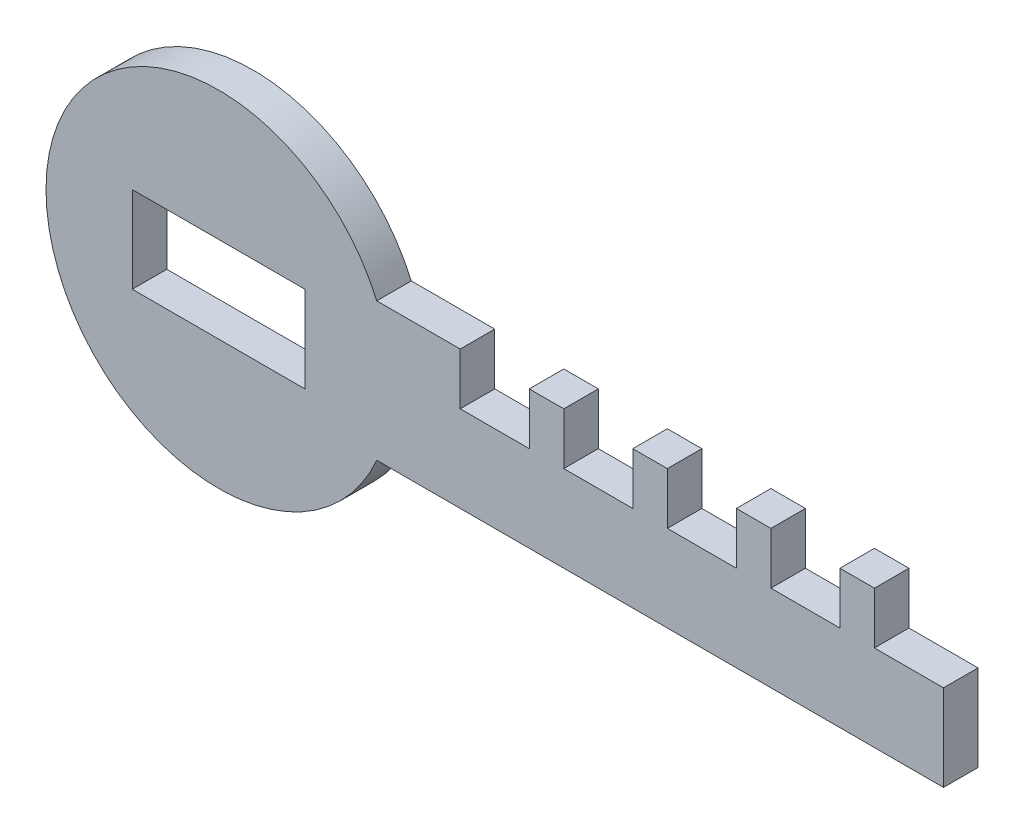
ISO-10303-21;
HEADER;
FILE_DESCRIPTION(('STEP AP214'),'2;1');
FILE_NAME('part.step','',(''),(''),'','','');
FILE_SCHEMA(('AUTOMOTIVE_DESIGN { 1 0 10303 214 1 1 1 1 }'));
ENDSEC;
DATA;
#1=APPLICATION_CONTEXT('core data for automotive mechanical design processes');
#2=APPLICATION_PROTOCOL_DEFINITION('international standard','automotive_design',2000,#1);
#3=PRODUCT_CONTEXT('',#1,'mechanical');
#4=PRODUCT('Part','Part','',(#3));
#5=PRODUCT_RELATED_PRODUCT_CATEGORY('part','',(#4));
#6=PRODUCT_DEFINITION_FORMATION('','',#4);
#7=PRODUCT_DEFINITION_CONTEXT('part definition',#1,'design');
#8=PRODUCT_DEFINITION('design','',#6,#7);
#9=PRODUCT_DEFINITION_SHAPE('','',#8);
#10=(LENGTH_UNIT() NAMED_UNIT(*) SI_UNIT(.MILLI.,.METRE.));
#11=(NAMED_UNIT(*) PLANE_ANGLE_UNIT() SI_UNIT($,.RADIAN.));
#12=(NAMED_UNIT(*) SI_UNIT($,.STERADIAN.) SOLID_ANGLE_UNIT());
#13=UNCERTAINTY_MEASURE_WITH_UNIT(LENGTH_MEASURE(1.E-05),#10,'distance_accuracy_value','');
#14=(GEOMETRIC_REPRESENTATION_CONTEXT(3) GLOBAL_UNCERTAINTY_ASSIGNED_CONTEXT((#13)) GLOBAL_UNIT_ASSIGNED_CONTEXT((#10,
#11,#12)) REPRESENTATION_CONTEXT('',''));
#15=CARTESIAN_POINT('',(0.,0.,0.));
#16=DIRECTION('',(0.,0.,1.));
#17=DIRECTION('',(1.,0.,0.));
#18=AXIS2_PLACEMENT_3D('',#15,#16,#17);
#19=CARTESIAN_POINT('',(42.,4.,1.));
#20=DIRECTION('',(0.,-1.,0.));
#21=DIRECTION('',(0.,0.,-1.));
#22=AXIS2_PLACEMENT_3D('',#19,#20,#21);
#23=PLANE('',#22);
#24=DIRECTION('',(-1.,0.,0.));
#25=VECTOR('',#24,1.);
#26=CARTESIAN_POINT('',(42.,4.,1.));
#27=LINE('',#26,#25);
#28=CARTESIAN_POINT('',(14.,4.,1.));
#29=VERTEX_POINT('',#28);
#30=CARTESIAN_POINT('',(9.16515138991168,4.,1.));
#31=VERTEX_POINT('',#30);
#32=EDGE_CURVE('E428',#29,#31,#27,.T.);
#33=ORIENTED_EDGE('',*,*,#32,.F.);
#34=DIRECTION('',(0.,0.,-1.));
#35=VECTOR('',#34,1.);
#36=CARTESIAN_POINT('',(14.,4.,1.));
#37=LINE('',#36,#35);
#38=CARTESIAN_POINT('',(14.,4.,-1.));
#39=VERTEX_POINT('',#38);
#40=EDGE_CURVE('E11',#29,#39,#37,.T.);
#41=ORIENTED_EDGE('',*,*,#40,.T.);
#42=DIRECTION('',(-1.,0.,0.));
#43=VECTOR('',#42,1.);
#44=CARTESIAN_POINT('',(42.,4.,-1.));
#45=LINE('',#44,#43);
#46=CARTESIAN_POINT('',(9.1651513899117,4.,-1.));
#47=VERTEX_POINT('',#46);
#48=EDGE_CURVE('E251',#39,#47,#45,.T.);
#49=ORIENTED_EDGE('',*,*,#48,.T.);
#50=DIRECTION('',(0.,0.,-1.));
#51=VECTOR('',#50,1.);
#52=CARTESIAN_POINT('',(9.16515138991168,4.,1.));
#53=LINE('',#52,#51);
#54=EDGE_CURVE('E446',#47,#31,#53,.F.);
#55=ORIENTED_EDGE('',*,*,#54,.T.);
#56=EDGE_LOOP('',(#33,#41,#49,#55));
#57=FACE_BOUND('',#56,.T.);
#58=ADVANCED_FACE('F51',(#57),#23,.F.);
#59=CARTESIAN_POINT('',(20.,4.,-1.));
#60=VERTEX_POINT('',#59);
#61=CARTESIAN_POINT('',(18.,4.,-1.));
#62=VERTEX_POINT('',#61);
#63=EDGE_CURVE('E441',#60,#62,#45,.T.);
#64=ORIENTED_EDGE('',*,*,#63,.T.);
#65=DIRECTION('',(0.,0.,1.));
#66=VECTOR('',#65,1.);
#67=CARTESIAN_POINT('',(18.,4.,1.));
#68=LINE('',#67,#66);
#69=CARTESIAN_POINT('',(18.,4.,1.));
#70=VERTEX_POINT('',#69);
#71=EDGE_CURVE('E61',#62,#70,#68,.T.);
#72=ORIENTED_EDGE('',*,*,#71,.T.);
#73=CARTESIAN_POINT('',(20.,4.,1.));
#74=VERTEX_POINT('',#73);
#75=EDGE_CURVE('E431',#74,#70,#27,.T.);
#76=ORIENTED_EDGE('',*,*,#75,.F.);
#77=DIRECTION('',(0.,0.,-1.));
#78=VECTOR('',#77,1.);
#79=CARTESIAN_POINT('',(20.,4.,1.));
#80=LINE('',#79,#78);
#81=EDGE_CURVE('E484',#74,#60,#80,.T.);
#82=ORIENTED_EDGE('',*,*,#81,.T.);
#83=EDGE_LOOP('',(#64,#72,#76,#82));
#84=FACE_BOUND('',#83,.T.);
#85=ADVANCED_FACE('F493',(#84),#23,.F.);
#86=CARTESIAN_POINT('',(26.,4.,-1.));
#87=VERTEX_POINT('',#86);
#88=CARTESIAN_POINT('',(24.,4.,-1.));
#89=VERTEX_POINT('',#88);
#90=EDGE_CURVE('E546',#87,#89,#45,.T.);
#91=ORIENTED_EDGE('',*,*,#90,.T.);
#92=DIRECTION('',(0.,0.,1.));
#93=VECTOR('',#92,1.);
#94=CARTESIAN_POINT('',(24.,4.,1.));
#95=LINE('',#94,#93);
#96=CARTESIAN_POINT('',(24.,4.,1.));
#97=VERTEX_POINT('',#96);
#98=EDGE_CURVE('E481',#89,#97,#95,.T.);
#99=ORIENTED_EDGE('',*,*,#98,.T.);
#100=CARTESIAN_POINT('',(26.,4.,1.));
#101=VERTEX_POINT('',#100);
#102=EDGE_CURVE('E501',#101,#97,#27,.T.);
#103=ORIENTED_EDGE('',*,*,#102,.F.);
#104=DIRECTION('',(0.,0.,-1.));
#105=VECTOR('',#104,1.);
#106=CARTESIAN_POINT('',(26.,4.,1.));
#107=LINE('',#106,#105);
#108=EDGE_CURVE('E477',#101,#87,#107,.T.);
#109=ORIENTED_EDGE('',*,*,#108,.T.);
#110=EDGE_LOOP('',(#91,#99,#103,#109));
#111=FACE_BOUND('',#110,.T.);
#112=ADVANCED_FACE('F545',(#111),#23,.F.);
#113=CARTESIAN_POINT('',(32.,4.,-1.));
#114=VERTEX_POINT('',#113);
#115=CARTESIAN_POINT('',(30.,4.,-1.));
#116=VERTEX_POINT('',#115);
#117=EDGE_CURVE('E533',#114,#116,#45,.T.);
#118=ORIENTED_EDGE('',*,*,#117,.T.);
#119=DIRECTION('',(0.,0.,1.));
#120=VECTOR('',#119,1.);
#121=CARTESIAN_POINT('',(30.,4.,1.));
#122=LINE('',#121,#120);
#123=CARTESIAN_POINT('',(30.,4.,1.));
#124=VERTEX_POINT('',#123);
#125=EDGE_CURVE('E473',#116,#124,#122,.T.);
#126=ORIENTED_EDGE('',*,*,#125,.T.);
#127=CARTESIAN_POINT('',(32.,4.,1.));
#128=VERTEX_POINT('',#127);
#129=EDGE_CURVE('E505',#128,#124,#27,.T.);
#130=ORIENTED_EDGE('',*,*,#129,.F.);
#131=DIRECTION('',(0.,0.,-1.));
#132=VECTOR('',#131,1.);
#133=CARTESIAN_POINT('',(32.,4.,1.));
#134=LINE('',#133,#132);
#135=EDGE_CURVE('E469',#128,#114,#134,.T.);
#136=ORIENTED_EDGE('',*,*,#135,.T.);
#137=EDGE_LOOP('',(#118,#126,#130,#136));
#138=FACE_BOUND('',#137,.T.);
#139=ADVANCED_FACE('F532',(#138),#23,.F.);
#140=CARTESIAN_POINT('',(0.,0.,1.));
#141=DIRECTION('',(0.,0.,-1.));
#142=DIRECTION('',(-1.,0.,0.));
#143=AXIS2_PLACEMENT_3D('',#140,#141,#142);
#144=CYLINDRICAL_SURFACE('',#143,10.);
#145=DIRECTION('',(0.,0.,-1.));
#146=VECTOR('',#145,1.);
#147=CARTESIAN_POINT('',(9.16515138991168,-4.,1.));
#148=LINE('',#147,#146);
#149=CARTESIAN_POINT('',(9.16515138991168,-4.,1.));
#150=VERTEX_POINT('',#149);
#151=CARTESIAN_POINT('',(9.16515138991168,-4.,-1.));
#152=VERTEX_POINT('',#151);
#153=EDGE_CURVE('E450',#150,#152,#148,.T.);
#154=ORIENTED_EDGE('',*,*,#153,.F.);
#155=CARTESIAN_POINT('',(0.,0.,1.));
#156=DIRECTION('',(0.,0.,1.));
#157=DIRECTION('',(1.,0.,0.));
#158=AXIS2_PLACEMENT_3D('',#155,#156,#157);
#159=CIRCLE('',#158,10.);
#160=EDGE_CURVE('E455',#31,#150,#159,.T.);
#161=ORIENTED_EDGE('',*,*,#160,.F.);
#162=ORIENTED_EDGE('',*,*,#54,.F.);
#163=CARTESIAN_POINT('',(0.,0.,-1.));
#164=DIRECTION('',(0.,0.,1.));
#165=DIRECTION('',(1.,0.,0.));
#166=AXIS2_PLACEMENT_3D('',#163,#164,#165);
#167=CIRCLE('',#166,10.);
#168=EDGE_CURVE('E454',#47,#152,#167,.T.);
#169=ORIENTED_EDGE('',*,*,#168,.T.);
#170=EDGE_LOOP('',(#154,#161,#162,#169));
#171=FACE_BOUND('',#170,.T.);
#172=ADVANCED_FACE('F54',(#171),#144,.T.);
#173=CARTESIAN_POINT('',(0.,0.,1.));
#174=DIRECTION('',(0.,0.,1.));
#175=DIRECTION('',(1.,0.,0.));
#176=AXIS2_PLACEMENT_3D('',#173,#174,#175);
#177=PLANE('',#176);
#178=DIRECTION('',(0.,-1.,0.));
#179=VECTOR('',#178,1.);
#180=CARTESIAN_POINT('',(14.,7.,1.));
#181=LINE('',#180,#179);
#182=CARTESIAN_POINT('',(14.,1.,1.));
#183=VERTEX_POINT('',#182);
#184=EDGE_CURVE('E231',#29,#183,#181,.T.);
#185=ORIENTED_EDGE('',*,*,#184,.F.);
#186=ORIENTED_EDGE('',*,*,#32,.T.);
#187=ORIENTED_EDGE('',*,*,#160,.T.);
#188=DIRECTION('',(1.,0.,0.));
#189=VECTOR('',#188,1.);
#190=CARTESIAN_POINT('',(0.,-4.,1.));
#191=LINE('',#190,#189);
#192=CARTESIAN_POINT('',(42.,-4.,1.));
#193=VERTEX_POINT('',#192);
#194=EDGE_CURVE('E421',#150,#193,#191,.T.);
#195=ORIENTED_EDGE('',*,*,#194,.T.);
#196=DIRECTION('',(0.,1.,0.));
#197=VECTOR('',#196,1.);
#198=CARTESIAN_POINT('',(42.,-4.,1.));
#199=LINE('',#198,#197);
#200=CARTESIAN_POINT('',(42.,1.,1.));
#201=VERTEX_POINT('',#200);
#202=EDGE_CURVE('E423',#193,#201,#199,.T.);
#203=ORIENTED_EDGE('',*,*,#202,.T.);
#204=DIRECTION('',(1.,0.,0.));
#205=VECTOR('',#204,1.);
#206=CARTESIAN_POINT('',(38.,1.,1.));
#207=LINE('',#206,#205);
#208=CARTESIAN_POINT('',(38.,1.,1.));
#209=VERTEX_POINT('',#208);
#210=EDGE_CURVE('E365',#209,#201,#207,.T.);
#211=ORIENTED_EDGE('',*,*,#210,.F.);
#212=DIRECTION('',(0.,-1.,0.));
#213=VECTOR('',#212,1.);
#214=CARTESIAN_POINT('',(38.,7.,1.));
#215=LINE('',#214,#213);
#216=CARTESIAN_POINT('',(38.,4.,1.));
#217=VERTEX_POINT('',#216);
#218=EDGE_CURVE('E335',#217,#209,#215,.T.);
#219=ORIENTED_EDGE('',*,*,#218,.F.);
#220=CARTESIAN_POINT('',(36.,4.,1.));
#221=VERTEX_POINT('',#220);
#222=EDGE_CURVE('E432',#217,#221,#27,.T.);
#223=ORIENTED_EDGE('',*,*,#222,.T.);
#224=DIRECTION('',(0.,1.,0.));
#225=VECTOR('',#224,1.);
#226=CARTESIAN_POINT('',(36.,1.,1.));
#227=LINE('',#226,#225);
#228=CARTESIAN_POINT('',(36.,1.,1.));
#229=VERTEX_POINT('',#228);
#230=EDGE_CURVE('E336',#229,#221,#227,.T.);
#231=ORIENTED_EDGE('',*,*,#230,.F.);
#232=DIRECTION('',(1.,0.,0.));
#233=VECTOR('',#232,1.);
#234=CARTESIAN_POINT('',(32.,1.,1.));
#235=LINE('',#234,#233);
#236=CARTESIAN_POINT('',(32.,1.,1.));
#237=VERTEX_POINT('',#236);
#238=EDGE_CURVE('E339',#237,#229,#235,.T.);
#239=ORIENTED_EDGE('',*,*,#238,.F.);
#240=DIRECTION('',(0.,-1.,0.));
#241=VECTOR('',#240,1.);
#242=CARTESIAN_POINT('',(32.,7.,1.));
#243=LINE('',#242,#241);
#244=EDGE_CURVE('E306',#128,#237,#243,.T.);
#245=ORIENTED_EDGE('',*,*,#244,.F.);
#246=ORIENTED_EDGE('',*,*,#129,.T.);
#247=DIRECTION('',(0.,1.,0.));
#248=VECTOR('',#247,1.);
#249=CARTESIAN_POINT('',(30.,1.,1.));
#250=LINE('',#249,#248);
#251=CARTESIAN_POINT('',(30.,1.,1.));
#252=VERTEX_POINT('',#251);
#253=EDGE_CURVE('E307',#252,#124,#250,.T.);
#254=ORIENTED_EDGE('',*,*,#253,.F.);
#255=DIRECTION('',(1.,0.,0.));
#256=VECTOR('',#255,1.);
#257=CARTESIAN_POINT('',(26.,1.,1.));
#258=LINE('',#257,#256);
#259=CARTESIAN_POINT('',(26.,1.,1.));
#260=VERTEX_POINT('',#259);
#261=EDGE_CURVE('E310',#260,#252,#258,.T.);
#262=ORIENTED_EDGE('',*,*,#261,.F.);
#263=DIRECTION('',(0.,-1.,0.));
#264=VECTOR('',#263,1.);
#265=CARTESIAN_POINT('',(26.,7.,1.));
#266=LINE('',#265,#264);
#267=EDGE_CURVE('E278',#101,#260,#266,.T.);
#268=ORIENTED_EDGE('',*,*,#267,.F.);
#269=ORIENTED_EDGE('',*,*,#102,.T.);
#270=DIRECTION('',(0.,1.,0.));
#271=VECTOR('',#270,1.);
#272=CARTESIAN_POINT('',(24.,1.,1.));
#273=LINE('',#272,#271);
#274=CARTESIAN_POINT('',(24.,1.,1.));
#275=VERTEX_POINT('',#274);
#276=EDGE_CURVE('E76',#275,#97,#273,.T.);
#277=ORIENTED_EDGE('',*,*,#276,.F.);
#278=DIRECTION('',(1.,0.,0.));
#279=VECTOR('',#278,1.);
#280=CARTESIAN_POINT('',(20.,1.,1.));
#281=LINE('',#280,#279);
#282=CARTESIAN_POINT('',(20.,1.,1.));
#283=VERTEX_POINT('',#282);
#284=EDGE_CURVE('E281',#283,#275,#281,.T.);
#285=ORIENTED_EDGE('',*,*,#284,.F.);
#286=DIRECTION('',(0.,-1.,0.));
#287=VECTOR('',#286,1.);
#288=CARTESIAN_POINT('',(20.,7.,1.));
#289=LINE('',#288,#287);
#290=EDGE_CURVE('E264',#74,#283,#289,.T.);
#291=ORIENTED_EDGE('',*,*,#290,.F.);
#292=ORIENTED_EDGE('',*,*,#75,.T.);
#293=DIRECTION('',(0.,1.,0.));
#294=VECTOR('',#293,1.);
#295=CARTESIAN_POINT('',(18.,1.,1.));
#296=LINE('',#295,#294);
#297=CARTESIAN_POINT('',(18.,1.,1.));
#298=VERTEX_POINT('',#297);
#299=EDGE_CURVE('E68',#298,#70,#296,.T.);
#300=ORIENTED_EDGE('',*,*,#299,.F.);
#301=DIRECTION('',(1.,0.,0.));
#302=VECTOR('',#301,1.);
#303=CARTESIAN_POINT('',(14.,1.,1.));
#304=LINE('',#303,#302);
#305=EDGE_CURVE('E257',#183,#298,#304,.T.);
#306=ORIENTED_EDGE('',*,*,#305,.F.);
#307=EDGE_LOOP('',(#185,#186,#187,#195,#203,#211,#219,#223,#231,#239,#245,#246,#254,#262,#268,
#269,#277,#285,#291,#292,#300,#306));
#308=FACE_BOUND('',#307,.T.);
#309=DIRECTION('',(0.,-1.,0.));
#310=VECTOR('',#309,1.);
#311=CARTESIAN_POINT('',(-5.,2.5,1.));
#312=LINE('',#311,#310);
#313=CARTESIAN_POINT('',(-5.,2.5,1.));
#314=VERTEX_POINT('',#313);
#315=CARTESIAN_POINT('',(-5.,-2.5,1.));
#316=VERTEX_POINT('',#315);
#317=EDGE_CURVE('E268',#314,#316,#312,.T.);
#318=ORIENTED_EDGE('',*,*,#317,.F.);
#319=DIRECTION('',(-1.,0.,0.));
#320=VECTOR('',#319,1.);
#321=CARTESIAN_POINT('',(5.,2.5,1.));
#322=LINE('',#321,#320);
#323=CARTESIAN_POINT('',(5.,2.5,1.));
#324=VERTEX_POINT('',#323);
#325=EDGE_CURVE('E382',#324,#314,#322,.T.);
#326=ORIENTED_EDGE('',*,*,#325,.F.);
#327=DIRECTION('',(0.,1.,0.));
#328=VECTOR('',#327,1.);
#329=CARTESIAN_POINT('',(5.,-2.5,1.));
#330=LINE('',#329,#328);
#331=CARTESIAN_POINT('',(5.,-2.5,1.));
#332=VERTEX_POINT('',#331);
#333=EDGE_CURVE('E401',#332,#324,#330,.T.);
#334=ORIENTED_EDGE('',*,*,#333,.F.);
#335=DIRECTION('',(1.,0.,0.));
#336=VECTOR('',#335,1.);
#337=CARTESIAN_POINT('',(-5.,-2.5,1.));
#338=LINE('',#337,#336);
#339=EDGE_CURVE('E397',#316,#332,#338,.T.);
#340=ORIENTED_EDGE('',*,*,#339,.F.);
#341=EDGE_LOOP('',(#318,#326,#334,#340));
#342=FACE_BOUND('',#341,.T.);
#343=ADVANCED_FACE('F497',(#308,#342),#177,.T.);
#344=CARTESIAN_POINT('',(0.,0.,-1.));
#345=DIRECTION('',(0.,0.,1.));
#346=DIRECTION('',(1.,0.,0.));
#347=AXIS2_PLACEMENT_3D('',#344,#345,#346);
#348=PLANE('',#347);
#349=ORIENTED_EDGE('',*,*,#48,.F.);
#350=DIRECTION('',(0.,-1.,0.));
#351=VECTOR('',#350,1.);
#352=CARTESIAN_POINT('',(14.,7.,-1.));
#353=LINE('',#352,#351);
#354=CARTESIAN_POINT('',(14.,1.,-1.));
#355=VERTEX_POINT('',#354);
#356=EDGE_CURVE('E229',#39,#355,#353,.T.);
#357=ORIENTED_EDGE('',*,*,#356,.T.);
#358=DIRECTION('',(1.,0.,0.));
#359=VECTOR('',#358,1.);
#360=CARTESIAN_POINT('',(14.,1.,-1.));
#361=LINE('',#360,#359);
#362=CARTESIAN_POINT('',(18.,1.,-1.));
#363=VERTEX_POINT('',#362);
#364=EDGE_CURVE('E240',#355,#363,#361,.T.);
#365=ORIENTED_EDGE('',*,*,#364,.T.);
#366=DIRECTION('',(0.,1.,0.));
#367=VECTOR('',#366,1.);
#368=CARTESIAN_POINT('',(18.,1.,-1.));
#369=LINE('',#368,#367);
#370=EDGE_CURVE('E237',#363,#62,#369,.T.);
#371=ORIENTED_EDGE('',*,*,#370,.T.);
#372=ORIENTED_EDGE('',*,*,#63,.F.);
#373=DIRECTION('',(0.,-1.,0.));
#374=VECTOR('',#373,1.);
#375=CARTESIAN_POINT('',(20.,7.,-1.));
#376=LINE('',#375,#374);
#377=CARTESIAN_POINT('',(20.,1.,-1.));
#378=VERTEX_POINT('',#377);
#379=EDGE_CURVE('E282',#60,#378,#376,.T.);
#380=ORIENTED_EDGE('',*,*,#379,.T.);
#381=DIRECTION('',(1.,0.,0.));
#382=VECTOR('',#381,1.);
#383=CARTESIAN_POINT('',(20.,1.,-1.));
#384=LINE('',#383,#382);
#385=CARTESIAN_POINT('',(24.,1.,-1.));
#386=VERTEX_POINT('',#385);
#387=EDGE_CURVE('E291',#378,#386,#384,.T.);
#388=ORIENTED_EDGE('',*,*,#387,.T.);
#389=DIRECTION('',(0.,1.,0.));
#390=VECTOR('',#389,1.);
#391=CARTESIAN_POINT('',(24.,1.,-1.));
#392=LINE('',#391,#390);
#393=EDGE_CURVE('E274',#386,#89,#392,.T.);
#394=ORIENTED_EDGE('',*,*,#393,.T.);
#395=ORIENTED_EDGE('',*,*,#90,.F.);
#396=DIRECTION('',(0.,-1.,0.));
#397=VECTOR('',#396,1.);
#398=CARTESIAN_POINT('',(26.,7.,-1.));
#399=LINE('',#398,#397);
#400=CARTESIAN_POINT('',(26.,1.,-1.));
#401=VERTEX_POINT('',#400);
#402=EDGE_CURVE('E311',#87,#401,#399,.T.);
#403=ORIENTED_EDGE('',*,*,#402,.T.);
#404=DIRECTION('',(1.,0.,0.));
#405=VECTOR('',#404,1.);
#406=CARTESIAN_POINT('',(26.,1.,-1.));
#407=LINE('',#406,#405);
#408=CARTESIAN_POINT('',(30.,1.,-1.));
#409=VERTEX_POINT('',#408);
#410=EDGE_CURVE('E320',#401,#409,#407,.T.);
#411=ORIENTED_EDGE('',*,*,#410,.T.);
#412=DIRECTION('',(0.,1.,0.));
#413=VECTOR('',#412,1.);
#414=CARTESIAN_POINT('',(30.,1.,-1.));
#415=LINE('',#414,#413);
#416=EDGE_CURVE('E302',#409,#116,#415,.T.);
#417=ORIENTED_EDGE('',*,*,#416,.T.);
#418=ORIENTED_EDGE('',*,*,#117,.F.);
#419=DIRECTION('',(0.,-1.,0.));
#420=VECTOR('',#419,1.);
#421=CARTESIAN_POINT('',(32.,7.,-1.));
#422=LINE('',#421,#420);
#423=CARTESIAN_POINT('',(32.,1.,-1.));
#424=VERTEX_POINT('',#423);
#425=EDGE_CURVE('E340',#114,#424,#422,.T.);
#426=ORIENTED_EDGE('',*,*,#425,.T.);
#427=DIRECTION('',(1.,0.,0.));
#428=VECTOR('',#427,1.);
#429=CARTESIAN_POINT('',(32.,1.,-1.));
#430=LINE('',#429,#428);
#431=CARTESIAN_POINT('',(36.,1.,-1.));
#432=VERTEX_POINT('',#431);
#433=EDGE_CURVE('E349',#424,#432,#430,.T.);
#434=ORIENTED_EDGE('',*,*,#433,.T.);
#435=DIRECTION('',(0.,1.,0.));
#436=VECTOR('',#435,1.);
#437=CARTESIAN_POINT('',(36.,1.,-1.));
#438=LINE('',#437,#436);
#439=CARTESIAN_POINT('',(36.,4.,-1.));
#440=VERTEX_POINT('',#439);
#441=EDGE_CURVE('E331',#432,#440,#438,.T.);
#442=ORIENTED_EDGE('',*,*,#441,.T.);
#443=CARTESIAN_POINT('',(38.,4.,-1.));
#444=VERTEX_POINT('',#443);
#445=EDGE_CURVE('E424',#444,#440,#45,.T.);
#446=ORIENTED_EDGE('',*,*,#445,.F.);
#447=DIRECTION('',(0.,-1.,0.));
#448=VECTOR('',#447,1.);
#449=CARTESIAN_POINT('',(38.,7.,-1.));
#450=LINE('',#449,#448);
#451=CARTESIAN_POINT('',(38.,1.,-1.));
#452=VERTEX_POINT('',#451);
#453=EDGE_CURVE('E368',#444,#452,#450,.T.);
#454=ORIENTED_EDGE('',*,*,#453,.T.);
#455=DIRECTION('',(1.,0.,0.));
#456=VECTOR('',#455,1.);
#457=CARTESIAN_POINT('',(38.,1.,-1.));
#458=LINE('',#457,#456);
#459=CARTESIAN_POINT('',(42.,1.,-1.));
#460=VERTEX_POINT('',#459);
#461=EDGE_CURVE('E360',#452,#460,#458,.T.);
#462=ORIENTED_EDGE('',*,*,#461,.T.);
#463=DIRECTION('',(0.,1.,0.));
#464=VECTOR('',#463,1.);
#465=CARTESIAN_POINT('',(42.,-4.,-1.));
#466=LINE('',#465,#464);
#467=CARTESIAN_POINT('',(42.,-4.,-1.));
#468=VERTEX_POINT('',#467);
#469=EDGE_CURVE('E435',#468,#460,#466,.T.);
#470=ORIENTED_EDGE('',*,*,#469,.F.);
#471=DIRECTION('',(1.,0.,0.));
#472=VECTOR('',#471,1.);
#473=CARTESIAN_POINT('',(0.,-4.,-1.));
#474=LINE('',#473,#472);
#475=EDGE_CURVE('E411',#152,#468,#474,.T.);
#476=ORIENTED_EDGE('',*,*,#475,.F.);
#477=ORIENTED_EDGE('',*,*,#168,.F.);
#478=EDGE_LOOP('',(#349,#357,#365,#371,#372,#380,#388,#394,#395,#403,#411,#417,#418,#426,#434,
#442,#446,#454,#462,#470,#476,#477));
#479=FACE_BOUND('',#478,.T.);
#480=DIRECTION('',(-1.,0.,0.));
#481=VECTOR('',#480,1.);
#482=CARTESIAN_POINT('',(5.,2.5,-1.));
#483=LINE('',#482,#481);
#484=CARTESIAN_POINT('',(5.,2.5,-1.));
#485=VERTEX_POINT('',#484);
#486=CARTESIAN_POINT('',(-5.,2.5,-1.));
#487=VERTEX_POINT('',#486);
#488=EDGE_CURVE('E390',#485,#487,#483,.T.);
#489=ORIENTED_EDGE('',*,*,#488,.T.);
#490=DIRECTION('',(0.,-1.,0.));
#491=VECTOR('',#490,1.);
#492=CARTESIAN_POINT('',(-5.,2.5,-1.));
#493=LINE('',#492,#491);
#494=CARTESIAN_POINT('',(-5.,-2.5,-1.));
#495=VERTEX_POINT('',#494);
#496=EDGE_CURVE('E377',#487,#495,#493,.T.);
#497=ORIENTED_EDGE('',*,*,#496,.T.);
#498=DIRECTION('',(1.,0.,0.));
#499=VECTOR('',#498,1.);
#500=CARTESIAN_POINT('',(-5.,-2.5,-1.));
#501=LINE('',#500,#499);
#502=CARTESIAN_POINT('',(5.,-2.5,-1.));
#503=VERTEX_POINT('',#502);
#504=EDGE_CURVE('E381',#495,#503,#501,.T.);
#505=ORIENTED_EDGE('',*,*,#504,.T.);
#506=DIRECTION('',(0.,1.,0.));
#507=VECTOR('',#506,1.);
#508=CARTESIAN_POINT('',(5.,-2.5,-1.));
#509=LINE('',#508,#507);
#510=EDGE_CURVE('E386',#503,#485,#509,.T.);
#511=ORIENTED_EDGE('',*,*,#510,.T.);
#512=EDGE_LOOP('',(#489,#497,#505,#511));
#513=FACE_BOUND('',#512,.T.);
#514=ADVANCED_FACE('F248',(#479,#513),#348,.F.);
#515=CARTESIAN_POINT('',(0.,-4.,1.));
#516=DIRECTION('',(0.,1.,0.));
#517=DIRECTION('',(0.,0.,1.));
#518=AXIS2_PLACEMENT_3D('',#515,#516,#517);
#519=PLANE('',#518);
#520=ORIENTED_EDGE('',*,*,#194,.F.);
#521=ORIENTED_EDGE('',*,*,#153,.T.);
#522=ORIENTED_EDGE('',*,*,#475,.T.);
#523=DIRECTION('',(0.,0.,-1.));
#524=VECTOR('',#523,1.);
#525=CARTESIAN_POINT('',(42.,-4.,1.));
#526=LINE('',#525,#524);
#527=EDGE_CURVE('E442',#193,#468,#526,.T.);
#528=ORIENTED_EDGE('',*,*,#527,.F.);
#529=EDGE_LOOP('',(#520,#521,#522,#528));
#530=FACE_BOUND('',#529,.T.);
#531=ADVANCED_FACE('F566',(#530),#519,.F.);
#532=ORIENTED_EDGE('',*,*,#445,.T.);
#533=DIRECTION('',(0.,0.,1.));
#534=VECTOR('',#533,1.);
#535=CARTESIAN_POINT('',(36.,4.,1.));
#536=LINE('',#535,#534);
#537=EDGE_CURVE('E465',#440,#221,#536,.T.);
#538=ORIENTED_EDGE('',*,*,#537,.T.);
#539=ORIENTED_EDGE('',*,*,#222,.F.);
#540=DIRECTION('',(0.,0.,-1.));
#541=VECTOR('',#540,1.);
#542=CARTESIAN_POINT('',(38.,4.,1.));
#543=LINE('',#542,#541);
#544=EDGE_CURVE('E459',#217,#444,#543,.T.);
#545=ORIENTED_EDGE('',*,*,#544,.T.);
#546=EDGE_LOOP('',(#532,#538,#539,#545));
#547=FACE_BOUND('',#546,.T.);
#548=ADVANCED_FACE('F520',(#547),#23,.F.);
#549=CARTESIAN_POINT('',(42.,-4.,1.));
#550=DIRECTION('',(-1.,0.,0.));
#551=DIRECTION('',(0.,0.,1.));
#552=AXIS2_PLACEMENT_3D('',#549,#550,#551);
#553=PLANE('',#552);
#554=ORIENTED_EDGE('',*,*,#469,.T.);
#555=DIRECTION('',(0.,0.,1.));
#556=VECTOR('',#555,1.);
#557=CARTESIAN_POINT('',(42.,1.,-1.));
#558=LINE('',#557,#556);
#559=EDGE_CURVE('E361',#460,#201,#558,.T.);
#560=ORIENTED_EDGE('',*,*,#559,.T.);
#561=ORIENTED_EDGE('',*,*,#202,.F.);
#562=ORIENTED_EDGE('',*,*,#527,.T.);
#563=EDGE_LOOP('',(#554,#560,#561,#562));
#564=FACE_BOUND('',#563,.T.);
#565=ADVANCED_FACE('F571',(#564),#553,.F.);
#566=CARTESIAN_POINT('',(-5.,2.5,-1.));
#567=DIRECTION('',(-1.,0.,0.));
#568=DIRECTION('',(0.,0.,1.));
#569=AXIS2_PLACEMENT_3D('',#566,#567,#568);
#570=PLANE('',#569);
#571=ORIENTED_EDGE('',*,*,#317,.T.);
#572=DIRECTION('',(0.,0.,1.));
#573=VECTOR('',#572,1.);
#574=CARTESIAN_POINT('',(-5.,-2.5,-1.));
#575=LINE('',#574,#573);
#576=EDGE_CURVE('E394',#495,#316,#575,.T.);
#577=ORIENTED_EDGE('',*,*,#576,.F.);
#578=ORIENTED_EDGE('',*,*,#496,.F.);
#579=DIRECTION('',(0.,0.,1.));
#580=VECTOR('',#579,1.);
#581=CARTESIAN_POINT('',(-5.,2.5,-1.));
#582=LINE('',#581,#580);
#583=EDGE_CURVE('E408',#487,#314,#582,.T.);
#584=ORIENTED_EDGE('',*,*,#583,.T.);
#585=EDGE_LOOP('',(#571,#577,#578,#584));
#586=FACE_BOUND('',#585,.T.);
#587=ADVANCED_FACE('F601',(#586),#570,.F.);
#588=CARTESIAN_POINT('',(5.,2.5,-1.));
#589=DIRECTION('',(0.,1.,0.));
#590=DIRECTION('',(0.,0.,1.));
#591=AXIS2_PLACEMENT_3D('',#588,#589,#590);
#592=PLANE('',#591);
#593=ORIENTED_EDGE('',*,*,#325,.T.);
#594=ORIENTED_EDGE('',*,*,#583,.F.);
#595=ORIENTED_EDGE('',*,*,#488,.F.);
#596=DIRECTION('',(0.,0.,1.));
#597=VECTOR('',#596,1.);
#598=CARTESIAN_POINT('',(5.,2.5,-1.));
#599=LINE('',#598,#597);
#600=EDGE_CURVE('E412',#485,#324,#599,.T.);
#601=ORIENTED_EDGE('',*,*,#600,.T.);
#602=EDGE_LOOP('',(#593,#594,#595,#601));
#603=FACE_BOUND('',#602,.T.);
#604=ADVANCED_FACE('F635',(#603),#592,.F.);
#605=CARTESIAN_POINT('',(5.,-2.5,-1.));
#606=DIRECTION('',(1.,0.,0.));
#607=DIRECTION('',(0.,0.,-1.));
#608=AXIS2_PLACEMENT_3D('',#605,#606,#607);
#609=PLANE('',#608);
#610=ORIENTED_EDGE('',*,*,#333,.T.);
#611=ORIENTED_EDGE('',*,*,#600,.F.);
#612=ORIENTED_EDGE('',*,*,#510,.F.);
#613=DIRECTION('',(0.,0.,1.));
#614=VECTOR('',#613,1.);
#615=CARTESIAN_POINT('',(5.,-2.5,-1.));
#616=LINE('',#615,#614);
#617=EDGE_CURVE('E415',#503,#332,#616,.T.);
#618=ORIENTED_EDGE('',*,*,#617,.T.);
#619=EDGE_LOOP('',(#610,#611,#612,#618));
#620=FACE_BOUND('',#619,.T.);
#621=ADVANCED_FACE('F585',(#620),#609,.F.);
#622=CARTESIAN_POINT('',(-5.,-2.5,-1.));
#623=DIRECTION('',(0.,-1.,0.));
#624=DIRECTION('',(0.,0.,-1.));
#625=AXIS2_PLACEMENT_3D('',#622,#623,#624);
#626=PLANE('',#625);
#627=ORIENTED_EDGE('',*,*,#339,.T.);
#628=ORIENTED_EDGE('',*,*,#617,.F.);
#629=ORIENTED_EDGE('',*,*,#504,.F.);
#630=ORIENTED_EDGE('',*,*,#576,.T.);
#631=EDGE_LOOP('',(#627,#628,#629,#630));
#632=FACE_BOUND('',#631,.T.);
#633=ADVANCED_FACE('F578',(#632),#626,.F.);
#634=CARTESIAN_POINT('',(38.,7.,-1.));
#635=DIRECTION('',(-1.,0.,0.));
#636=DIRECTION('',(0.,0.,1.));
#637=AXIS2_PLACEMENT_3D('',#634,#635,#636);
#638=PLANE('',#637);
#639=ORIENTED_EDGE('',*,*,#218,.T.);
#640=DIRECTION('',(0.,0.,1.));
#641=VECTOR('',#640,1.);
#642=CARTESIAN_POINT('',(38.,1.,-1.));
#643=LINE('',#642,#641);
#644=EDGE_CURVE('E356',#452,#209,#643,.T.);
#645=ORIENTED_EDGE('',*,*,#644,.F.);
#646=ORIENTED_EDGE('',*,*,#453,.F.);
#647=ORIENTED_EDGE('',*,*,#544,.F.);
#648=EDGE_LOOP('',(#639,#645,#646,#647));
#649=FACE_BOUND('',#648,.T.);
#650=ADVANCED_FACE('F576',(#649),#638,.F.);
#651=CARTESIAN_POINT('',(38.,1.,-1.));
#652=DIRECTION('',(0.,-1.,0.));
#653=DIRECTION('',(0.,0.,-1.));
#654=AXIS2_PLACEMENT_3D('',#651,#652,#653);
#655=PLANE('',#654);
#656=ORIENTED_EDGE('',*,*,#210,.T.);
#657=ORIENTED_EDGE('',*,*,#559,.F.);
#658=ORIENTED_EDGE('',*,*,#461,.F.);
#659=ORIENTED_EDGE('',*,*,#644,.T.);
#660=EDGE_LOOP('',(#656,#657,#658,#659));
#661=FACE_BOUND('',#660,.T.);
#662=ADVANCED_FACE('F573',(#661),#655,.F.);
#663=CARTESIAN_POINT('',(32.,7.,-1.));
#664=DIRECTION('',(-1.,0.,0.));
#665=DIRECTION('',(0.,0.,1.));
#666=AXIS2_PLACEMENT_3D('',#663,#664,#665);
#667=PLANE('',#666);
#668=ORIENTED_EDGE('',*,*,#244,.T.);
#669=DIRECTION('',(0.,0.,1.));
#670=VECTOR('',#669,1.);
#671=CARTESIAN_POINT('',(32.,1.,-1.));
#672=LINE('',#671,#670);
#673=EDGE_CURVE('E327',#424,#237,#672,.T.);
#674=ORIENTED_EDGE('',*,*,#673,.F.);
#675=ORIENTED_EDGE('',*,*,#425,.F.);
#676=ORIENTED_EDGE('',*,*,#135,.F.);
#677=EDGE_LOOP('',(#668,#674,#675,#676));
#678=FACE_BOUND('',#677,.T.);
#679=ADVANCED_FACE('F583',(#678),#667,.F.);
#680=CARTESIAN_POINT('',(36.,1.,-1.));
#681=DIRECTION('',(1.,0.,0.));
#682=DIRECTION('',(0.,0.,-1.));
#683=AXIS2_PLACEMENT_3D('',#680,#681,#682);
#684=PLANE('',#683);
#685=ORIENTED_EDGE('',*,*,#441,.F.);
#686=DIRECTION('',(0.,0.,1.));
#687=VECTOR('',#686,1.);
#688=CARTESIAN_POINT('',(36.,1.,-1.));
#689=LINE('',#688,#687);
#690=EDGE_CURVE('E332',#432,#229,#689,.T.);
#691=ORIENTED_EDGE('',*,*,#690,.T.);
#692=ORIENTED_EDGE('',*,*,#230,.T.);
#693=ORIENTED_EDGE('',*,*,#537,.F.);
#694=EDGE_LOOP('',(#685,#691,#692,#693));
#695=FACE_BOUND('',#694,.T.);
#696=ADVANCED_FACE('F524',(#695),#684,.F.);
#697=CARTESIAN_POINT('',(32.,1.,-1.));
#698=DIRECTION('',(0.,-1.,0.));
#699=DIRECTION('',(0.,0.,-1.));
#700=AXIS2_PLACEMENT_3D('',#697,#698,#699);
#701=PLANE('',#700);
#702=ORIENTED_EDGE('',*,*,#238,.T.);
#703=ORIENTED_EDGE('',*,*,#690,.F.);
#704=ORIENTED_EDGE('',*,*,#433,.F.);
#705=ORIENTED_EDGE('',*,*,#673,.T.);
#706=EDGE_LOOP('',(#702,#703,#704,#705));
#707=FACE_BOUND('',#706,.T.);
#708=ADVANCED_FACE('F528',(#707),#701,.F.);
#709=CARTESIAN_POINT('',(26.,7.,-1.));
#710=DIRECTION('',(-1.,0.,0.));
#711=DIRECTION('',(0.,0.,1.));
#712=AXIS2_PLACEMENT_3D('',#709,#710,#711);
#713=PLANE('',#712);
#714=ORIENTED_EDGE('',*,*,#267,.T.);
#715=DIRECTION('',(0.,0.,1.));
#716=VECTOR('',#715,1.);
#717=CARTESIAN_POINT('',(26.,1.,-1.));
#718=LINE('',#717,#716);
#719=EDGE_CURVE('E298',#401,#260,#718,.T.);
#720=ORIENTED_EDGE('',*,*,#719,.F.);
#721=ORIENTED_EDGE('',*,*,#402,.F.);
#722=ORIENTED_EDGE('',*,*,#108,.F.);
#723=EDGE_LOOP('',(#714,#720,#721,#722));
#724=FACE_BOUND('',#723,.T.);
#725=ADVANCED_FACE('F736',(#724),#713,.F.);
#726=CARTESIAN_POINT('',(30.,1.,-1.));
#727=DIRECTION('',(1.,0.,0.));
#728=DIRECTION('',(0.,0.,-1.));
#729=AXIS2_PLACEMENT_3D('',#726,#727,#728);
#730=PLANE('',#729);
#731=ORIENTED_EDGE('',*,*,#416,.F.);
#732=DIRECTION('',(0.,0.,1.));
#733=VECTOR('',#732,1.);
#734=CARTESIAN_POINT('',(30.,1.,-1.));
#735=LINE('',#734,#733);
#736=EDGE_CURVE('E303',#409,#252,#735,.T.);
#737=ORIENTED_EDGE('',*,*,#736,.T.);
#738=ORIENTED_EDGE('',*,*,#253,.T.);
#739=ORIENTED_EDGE('',*,*,#125,.F.);
#740=EDGE_LOOP('',(#731,#737,#738,#739));
#741=FACE_BOUND('',#740,.T.);
#742=ADVANCED_FACE('F536',(#741),#730,.F.);
#743=CARTESIAN_POINT('',(26.,1.,-1.));
#744=DIRECTION('',(0.,-1.,0.));
#745=DIRECTION('',(0.,0.,-1.));
#746=AXIS2_PLACEMENT_3D('',#743,#744,#745);
#747=PLANE('',#746);
#748=ORIENTED_EDGE('',*,*,#261,.T.);
#749=ORIENTED_EDGE('',*,*,#736,.F.);
#750=ORIENTED_EDGE('',*,*,#410,.F.);
#751=ORIENTED_EDGE('',*,*,#719,.T.);
#752=EDGE_LOOP('',(#748,#749,#750,#751));
#753=FACE_BOUND('',#752,.T.);
#754=ADVANCED_FACE('F540',(#753),#747,.F.);
#755=CARTESIAN_POINT('',(20.,7.,-1.));
#756=DIRECTION('',(-1.,0.,0.));
#757=DIRECTION('',(0.,0.,1.));
#758=AXIS2_PLACEMENT_3D('',#755,#756,#757);
#759=PLANE('',#758);
#760=ORIENTED_EDGE('',*,*,#290,.T.);
#761=DIRECTION('',(0.,0.,1.));
#762=VECTOR('',#761,1.);
#763=CARTESIAN_POINT('',(20.,1.,-1.));
#764=LINE('',#763,#762);
#765=EDGE_CURVE('E270',#378,#283,#764,.T.);
#766=ORIENTED_EDGE('',*,*,#765,.F.);
#767=ORIENTED_EDGE('',*,*,#379,.F.);
#768=ORIENTED_EDGE('',*,*,#81,.F.);
#769=EDGE_LOOP('',(#760,#766,#767,#768));
#770=FACE_BOUND('',#769,.T.);
#771=ADVANCED_FACE('F553',(#770),#759,.F.);
#772=CARTESIAN_POINT('',(24.,1.,-1.));
#773=DIRECTION('',(1.,0.,0.));
#774=DIRECTION('',(0.,0.,-1.));
#775=AXIS2_PLACEMENT_3D('',#772,#773,#774);
#776=PLANE('',#775);
#777=ORIENTED_EDGE('',*,*,#393,.F.);
#778=DIRECTION('',(0.,0.,1.));
#779=VECTOR('',#778,1.);
#780=CARTESIAN_POINT('',(24.,1.,-1.));
#781=LINE('',#780,#779);
#782=EDGE_CURVE('E275',#386,#275,#781,.T.);
#783=ORIENTED_EDGE('',*,*,#782,.T.);
#784=ORIENTED_EDGE('',*,*,#276,.T.);
#785=ORIENTED_EDGE('',*,*,#98,.F.);
#786=EDGE_LOOP('',(#777,#783,#784,#785));
#787=FACE_BOUND('',#786,.T.);
#788=ADVANCED_FACE('F548',(#787),#776,.F.);
#789=CARTESIAN_POINT('',(20.,1.,-1.));
#790=DIRECTION('',(0.,-1.,0.));
#791=DIRECTION('',(0.,0.,-1.));
#792=AXIS2_PLACEMENT_3D('',#789,#790,#791);
#793=PLANE('',#792);
#794=ORIENTED_EDGE('',*,*,#284,.T.);
#795=ORIENTED_EDGE('',*,*,#782,.F.);
#796=ORIENTED_EDGE('',*,*,#387,.F.);
#797=ORIENTED_EDGE('',*,*,#765,.T.);
#798=EDGE_LOOP('',(#794,#795,#796,#797));
#799=FACE_BOUND('',#798,.T.);
#800=ADVANCED_FACE('F551',(#799),#793,.F.);
#801=CARTESIAN_POINT('',(14.,7.,-1.));
#802=DIRECTION('',(-1.,0.,0.));
#803=DIRECTION('',(0.,0.,1.));
#804=AXIS2_PLACEMENT_3D('',#801,#802,#803);
#805=PLANE('',#804);
#806=ORIENTED_EDGE('',*,*,#184,.T.);
#807=DIRECTION('',(0.,0.,1.));
#808=VECTOR('',#807,1.);
#809=CARTESIAN_POINT('',(14.,1.,-1.));
#810=LINE('',#809,#808);
#811=EDGE_CURVE('E225',#355,#183,#810,.T.);
#812=ORIENTED_EDGE('',*,*,#811,.F.);
#813=ORIENTED_EDGE('',*,*,#356,.F.);
#814=ORIENTED_EDGE('',*,*,#40,.F.);
#815=EDGE_LOOP('',(#806,#812,#813,#814));
#816=FACE_BOUND('',#815,.T.);
#817=ADVANCED_FACE('F227',(#816),#805,.F.);
#818=CARTESIAN_POINT('',(18.,1.,-1.));
#819=DIRECTION('',(1.,0.,0.));
#820=DIRECTION('',(0.,0.,-1.));
#821=AXIS2_PLACEMENT_3D('',#818,#819,#820);
#822=PLANE('',#821);
#823=ORIENTED_EDGE('',*,*,#370,.F.);
#824=DIRECTION('',(0.,0.,1.));
#825=VECTOR('',#824,1.);
#826=CARTESIAN_POINT('',(18.,1.,-1.));
#827=LINE('',#826,#825);
#828=EDGE_CURVE('E236',#363,#298,#827,.T.);
#829=ORIENTED_EDGE('',*,*,#828,.T.);
#830=ORIENTED_EDGE('',*,*,#299,.T.);
#831=ORIENTED_EDGE('',*,*,#71,.F.);
#832=EDGE_LOOP('',(#823,#829,#830,#831));
#833=FACE_BOUND('',#832,.T.);
#834=ADVANCED_FACE('F557',(#833),#822,.F.);
#835=CARTESIAN_POINT('',(14.,1.,-1.));
#836=DIRECTION('',(0.,-1.,0.));
#837=DIRECTION('',(0.,0.,-1.));
#838=AXIS2_PLACEMENT_3D('',#835,#836,#837);
#839=PLANE('',#838);
#840=ORIENTED_EDGE('',*,*,#305,.T.);
#841=ORIENTED_EDGE('',*,*,#828,.F.);
#842=ORIENTED_EDGE('',*,*,#364,.F.);
#843=ORIENTED_EDGE('',*,*,#811,.T.);
#844=EDGE_LOOP('',(#840,#841,#842,#843));
#845=FACE_BOUND('',#844,.T.);
#846=ADVANCED_FACE('F241',(#845),#839,.F.);
#847=CLOSED_SHELL('',(#58,#85,#112,#139,#172,#343,#514,#531,#548,#565,#587,#604,#621,#633,#650,
#662,#679,#696,#708,#725,#742,#754,#771,#788,#800,#817,#834,#846));
#848=MANIFOLD_SOLID_BREP('B2',#847);
#849=ADVANCED_BREP_SHAPE_REPRESENTATION('',(#18,#848),#14);
#850=SHAPE_DEFINITION_REPRESENTATION(#9,#849);
ENDSEC;
END-ISO-10303-21;
